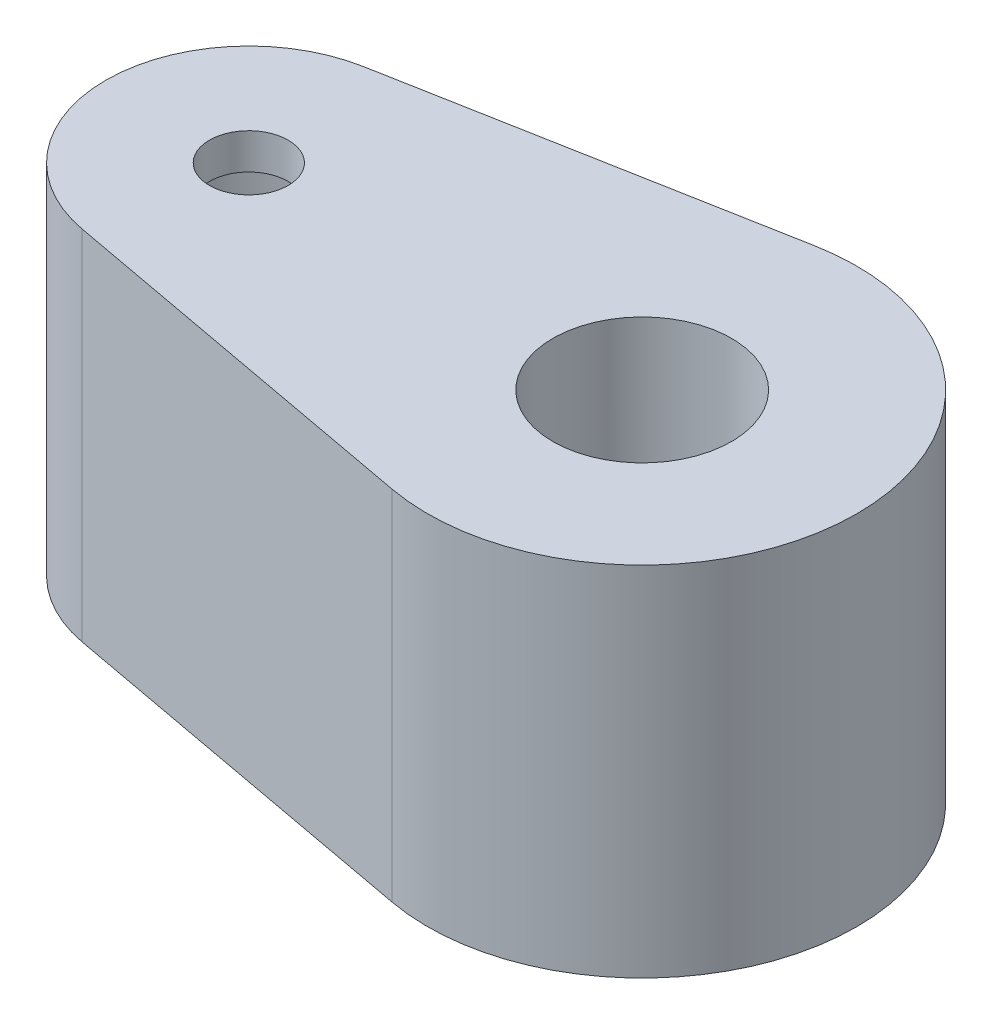
ISO-10303-21;
HEADER;
FILE_DESCRIPTION(('STEP AP214'),'2;1');
FILE_NAME('part.step','',(''),(''),'','','');
FILE_SCHEMA(('AUTOMOTIVE_DESIGN { 1 0 10303 214 1 1 1 1 }'));
ENDSEC;
DATA;
#1=APPLICATION_CONTEXT('core data for automotive mechanical design processes');
#2=APPLICATION_PROTOCOL_DEFINITION('international standard','automotive_design',2000,#1);
#3=PRODUCT_CONTEXT('',#1,'mechanical');
#4=PRODUCT('Part','Part','',(#3));
#5=PRODUCT_RELATED_PRODUCT_CATEGORY('part','',(#4));
#6=PRODUCT_DEFINITION_FORMATION('','',#4);
#7=PRODUCT_DEFINITION_CONTEXT('part definition',#1,'design');
#8=PRODUCT_DEFINITION('design','',#6,#7);
#9=PRODUCT_DEFINITION_SHAPE('','',#8);
#10=(LENGTH_UNIT() NAMED_UNIT(*) SI_UNIT(.MILLI.,.METRE.));
#11=(NAMED_UNIT(*) PLANE_ANGLE_UNIT() SI_UNIT($,.RADIAN.));
#12=(NAMED_UNIT(*) SI_UNIT($,.STERADIAN.) SOLID_ANGLE_UNIT());
#13=UNCERTAINTY_MEASURE_WITH_UNIT(LENGTH_MEASURE(1.E-05),#10,'distance_accuracy_value','');
#14=(GEOMETRIC_REPRESENTATION_CONTEXT(3) GLOBAL_UNCERTAINTY_ASSIGNED_CONTEXT((#13)) GLOBAL_UNIT_ASSIGNED_CONTEXT((#10,
#11,#12)) REPRESENTATION_CONTEXT('',''));
#15=CARTESIAN_POINT('',(0.,0.,0.));
#16=DIRECTION('',(0.,0.,1.));
#17=DIRECTION('',(1.,0.,0.));
#18=AXIS2_PLACEMENT_3D('',#15,#16,#17);
#19=CARTESIAN_POINT('',(11.,-31.4069194034804,0.));
#20=DIRECTION('',(0.,1.,0.));
#21=DIRECTION('',(0.,0.,1.));
#22=AXIS2_PLACEMENT_3D('',#19,#20,#21);
#23=CYLINDRICAL_SURFACE('',#22,2.5);
#24=CARTESIAN_POINT('',(11.,0.,0.));
#25=DIRECTION('',(0.,1.,0.));
#26=DIRECTION('',(0.,0.,1.));
#27=AXIS2_PLACEMENT_3D('',#24,#25,#26);
#28=CIRCLE('',#27,2.5);
#29=CARTESIAN_POINT('',(11.,0.,2.5));
#30=VERTEX_POINT('',#29);
#31=EDGE_CURVE('E85',#30,#30,#28,.T.);
#32=ORIENTED_EDGE('',*,*,#31,.T.);
#33=EDGE_LOOP('',(#32));
#34=FACE_BOUND('',#33,.T.);
#35=CARTESIAN_POINT('',(11.,-7.,0.));
#36=DIRECTION('',(0.,-1.,0.));
#37=DIRECTION('',(0.,0.,-1.));
#38=AXIS2_PLACEMENT_3D('',#35,#36,#37);
#39=CIRCLE('',#38,2.5);
#40=CARTESIAN_POINT('',(11.,-7.,-2.5));
#41=VERTEX_POINT('',#40);
#42=EDGE_CURVE('E106',#41,#41,#39,.F.);
#43=ORIENTED_EDGE('',*,*,#42,.F.);
#44=EDGE_LOOP('',(#43));
#45=FACE_BOUND('',#44,.T.);
#46=ADVANCED_FACE('F35',(#34,#45),#23,.F.);
#47=CARTESIAN_POINT('',(0.,-1.,0.));
#48=DIRECTION('',(0.,-1.,0.));
#49=DIRECTION('',(0.,0.,-1.));
#50=AXIS2_PLACEMENT_3D('',#47,#48,#49);
#51=PLANE('',#50);
#52=CARTESIAN_POINT('',(0.,-1.,0.));
#53=DIRECTION('',(0.,-1.,0.));
#54=DIRECTION('',(0.,0.,-1.));
#55=AXIS2_PLACEMENT_3D('',#52,#53,#54);
#56=CIRCLE('',#55,1.1);
#57=CARTESIAN_POINT('',(0.,-0.999999999999999,-1.1));
#58=VERTEX_POINT('',#57);
#59=EDGE_CURVE('E101',#58,#58,#56,.T.);
#60=ORIENTED_EDGE('',*,*,#59,.F.);
#61=EDGE_LOOP('',(#60));
#62=FACE_BOUND('',#61,.T.);
#63=CARTESIAN_POINT('',(0.,-1.,0.));
#64=DIRECTION('',(0.,-1.,0.));
#65=DIRECTION('',(0.,0.,-1.));
#66=AXIS2_PLACEMENT_3D('',#63,#64,#65);
#67=CIRCLE('',#66,3.25);
#68=CARTESIAN_POINT('',(0.,-1.,-3.25));
#69=VERTEX_POINT('',#68);
#70=EDGE_CURVE('E11',#69,#69,#67,.F.);
#71=ORIENTED_EDGE('',*,*,#70,.F.);
#72=EDGE_LOOP('',(#71));
#73=FACE_BOUND('',#72,.T.);
#74=ADVANCED_FACE('F152',(#62,#73),#51,.T.);
#75=CARTESIAN_POINT('',(0.,6.5,0.));
#76=DIRECTION('',(0.,-1.,0.));
#77=DIRECTION('',(0.,0.,-1.));
#78=AXIS2_PLACEMENT_3D('',#75,#76,#77);
#79=CYLINDRICAL_SURFACE('',#78,1.1);
#80=CARTESIAN_POINT('',(0.,0.,0.));
#81=DIRECTION('',(0.,-1.,0.));
#82=DIRECTION('',(0.,0.,-1.));
#83=AXIS2_PLACEMENT_3D('',#80,#81,#82);
#84=CIRCLE('',#83,1.1);
#85=CARTESIAN_POINT('',(0.,0.,-1.1));
#86=VERTEX_POINT('',#85);
#87=EDGE_CURVE('E39',#86,#86,#84,.T.);
#88=CARTESIAN_POINT('',(0.,0.,-1.1));
#89=CARTESIAN_POINT('',(0.,-0.0104166666666667,-1.1));
#90=CARTESIAN_POINT('',(0.,-0.0208333333333333,-1.1));
#91=CARTESIAN_POINT('',(0.,-0.0416666666666667,-1.1));
#92=CARTESIAN_POINT('',(0.,-0.0520833333333334,-1.1));
#93=CARTESIAN_POINT('',(0.,-0.0729166666666667,-1.1));
#94=CARTESIAN_POINT('',(0.,-0.0833333333333334,-1.1));
#95=CARTESIAN_POINT('',(0.,-0.104166666666667,-1.1));
#96=CARTESIAN_POINT('',(0.,-0.114583333333333,-1.1));
#97=CARTESIAN_POINT('',(0.,-0.135416666666667,-1.1));
#98=CARTESIAN_POINT('',(0.,-0.145833333333333,-1.1));
#99=CARTESIAN_POINT('',(0.,-0.166666666666667,-1.1));
#100=CARTESIAN_POINT('',(0.,-0.177083333333333,-1.1));
#101=CARTESIAN_POINT('',(0.,-0.197916666666667,-1.1));
#102=CARTESIAN_POINT('',(0.,-0.208333333333334,-1.1));
#103=CARTESIAN_POINT('',(0.,-0.229166666666667,-1.1));
#104=CARTESIAN_POINT('',(0.,-0.239583333333334,-1.1));
#105=CARTESIAN_POINT('',(0.,-0.260416666666667,-1.1));
#106=CARTESIAN_POINT('',(0.,-0.270833333333333,-1.1));
#107=CARTESIAN_POINT('',(0.,-0.291666666666666,-1.1));
#108=CARTESIAN_POINT('',(0.,-0.302083333333333,-1.1));
#109=CARTESIAN_POINT('',(0.,-0.322916666666666,-1.1));
#110=CARTESIAN_POINT('',(0.,-0.333333333333333,-1.1));
#111=CARTESIAN_POINT('',(0.,-0.354166666666666,-1.1));
#112=CARTESIAN_POINT('',(0.,-0.364583333333333,-1.1));
#113=CARTESIAN_POINT('',(0.,-0.385416666666666,-1.1));
#114=CARTESIAN_POINT('',(0.,-0.395833333333333,-1.1));
#115=CARTESIAN_POINT('',(0.,-0.416666666666666,-1.1));
#116=CARTESIAN_POINT('',(0.,-0.427083333333333,-1.1));
#117=CARTESIAN_POINT('',(0.,-0.447916666666666,-1.1));
#118=CARTESIAN_POINT('',(0.,-0.458333333333333,-1.1));
#119=CARTESIAN_POINT('',(0.,-0.479166666666666,-1.1));
#120=CARTESIAN_POINT('',(0.,-0.489583333333333,-1.1));
#121=CARTESIAN_POINT('',(0.,-0.510416666666666,-1.1));
#122=CARTESIAN_POINT('',(0.,-0.520833333333333,-1.1));
#123=CARTESIAN_POINT('',(0.,-0.541666666666666,-1.1));
#124=CARTESIAN_POINT('',(0.,-0.552083333333333,-1.1));
#125=CARTESIAN_POINT('',(0.,-0.572916666666666,-1.1));
#126=CARTESIAN_POINT('',(0.,-0.583333333333333,-1.1));
#127=CARTESIAN_POINT('',(0.,-0.604166666666666,-1.1));
#128=CARTESIAN_POINT('',(0.,-0.614583333333333,-1.1));
#129=CARTESIAN_POINT('',(0.,-0.635416666666666,-1.1));
#130=CARTESIAN_POINT('',(0.,-0.645833333333333,-1.1));
#131=CARTESIAN_POINT('',(0.,-0.666666666666666,-1.1));
#132=CARTESIAN_POINT('',(0.,-0.677083333333333,-1.1));
#133=CARTESIAN_POINT('',(0.,-0.697916666666666,-1.1));
#134=CARTESIAN_POINT('',(0.,-0.708333333333332,-1.1));
#135=CARTESIAN_POINT('',(0.,-0.729166666666666,-1.1));
#136=CARTESIAN_POINT('',(0.,-0.739583333333332,-1.1));
#137=CARTESIAN_POINT('',(0.,-0.760416666666666,-1.1));
#138=CARTESIAN_POINT('',(0.,-0.770833333333332,-1.1));
#139=CARTESIAN_POINT('',(0.,-0.791666666666666,-1.1));
#140=CARTESIAN_POINT('',(0.,-0.802083333333332,-1.1));
#141=CARTESIAN_POINT('',(0.,-0.822916666666666,-1.1));
#142=CARTESIAN_POINT('',(0.,-0.833333333333332,-1.1));
#143=CARTESIAN_POINT('',(0.,-0.854166666666666,-1.1));
#144=CARTESIAN_POINT('',(0.,-0.864583333333332,-1.1));
#145=CARTESIAN_POINT('',(0.,-0.885416666666666,-1.1));
#146=CARTESIAN_POINT('',(0.,-0.895833333333332,-1.1));
#147=CARTESIAN_POINT('',(0.,-0.916666666666666,-1.1));
#148=CARTESIAN_POINT('',(0.,-0.927083333333332,-1.1));
#149=CARTESIAN_POINT('',(0.,-0.947916666666666,-1.1));
#150=CARTESIAN_POINT('',(0.,-0.958333333333332,-1.1));
#151=CARTESIAN_POINT('',(0.,-0.979166666666666,-1.1));
#152=CARTESIAN_POINT('',(0.,-0.989583333333333,-1.1));
#153=CARTESIAN_POINT('',(0.,-0.999999999999999,-1.1));
#154=B_SPLINE_CURVE_WITH_KNOTS('',3,(#88,#89,#90,#91,#92,#93,#94,#95,#96,#97,#98,#99,#100,#101,
#102,#103,#104,#105,#106,#107,#108,#109,#110,#111,#112,#113,#114,#115,#116,#117,#118,#119,#120,
#121,#122,#123,#124,#125,#126,#127,#128,#129,#130,#131,#132,#133,#134,#135,#136,#137,#138,#139,
#140,#141,#142,#143,#144,#145,#146,#147,#148,#149,#150,#151,#152,#153),.UNSPECIFIED.,.F.,.F.,(4,
2,2,2,2,2,2,2,2,2,2,2,2,2,2,2,2,2,2,2,2,2,2,2,2,2,2,2,2,2,2,2,4),(0.,0.03125,0.0625000000000001,
0.0937500000000001,0.125,0.15625,0.1875,0.21875,0.25,0.281249999999999,0.312499999999999,
0.343749999999999,0.374999999999999,0.40625,0.4375,0.46875,0.5,0.53125,0.5625,0.59375,0.625,
0.65625,0.6875,0.718749999999999,0.749999999999999,0.781249999999999,0.812499999999999,
0.843749999999999,0.874999999999999,0.906249999999999,0.937499999999999,0.968749999999999,
0.999999999999999),.UNSPECIFIED.);
#155=EDGE_CURVE('BSEAM37',#86,#58,#154,.T.);
#156=ORIENTED_EDGE('',*,*,#87,.F.);
#157=ORIENTED_EDGE('',*,*,#59,.T.);
#158=ORIENTED_EDGE('',*,*,#155,.T.);
#159=ORIENTED_EDGE('',*,*,#155,.F.);
#160=EDGE_LOOP('',(#156,#158,#157,#159));
#161=FACE_BOUND('',#160,.T.);
#162=ADVANCED_FACE('F37',(#161),#79,.F.);
#163=CARTESIAN_POINT('',(0.,0.,0.));
#164=DIRECTION('',(0.,-1.,0.));
#165=DIRECTION('',(0.,0.,-1.));
#166=AXIS2_PLACEMENT_3D('',#163,#164,#165);
#167=PLANE('',#166);
#168=CARTESIAN_POINT('',(0.,0.,0.));
#169=DIRECTION('',(0.,-1.,0.));
#170=DIRECTION('',(0.,0.,-1.));
#171=AXIS2_PLACEMENT_3D('',#168,#169,#170);
#172=CIRCLE('',#171,4.);
#173=CARTESIAN_POINT('',(-0.727272727272728,0.,3.93332866414254));
#174=VERTEX_POINT('',#173);
#175=CARTESIAN_POINT('',(-0.727272727272727,0.,-3.93332866414253));
#176=VERTEX_POINT('',#175);
#177=EDGE_CURVE('E44',#174,#176,#172,.T.);
#178=ORIENTED_EDGE('',*,*,#177,.F.);
#179=DIRECTION('',(0.983332166035633,0.,0.181818181818182));
#180=VECTOR('',#179,1.);
#181=CARTESIAN_POINT('',(-0.727272727272728,0.,3.93332866414254));
#182=LINE('',#181,#180);
#183=CARTESIAN_POINT('',(9.90909090909091,0.,5.8999929962138));
#184=VERTEX_POINT('',#183);
#185=EDGE_CURVE('E76',#174,#184,#182,.T.);
#186=ORIENTED_EDGE('',*,*,#185,.T.);
#187=CARTESIAN_POINT('',(11.,0.,0.));
#188=DIRECTION('',(0.,1.,0.));
#189=DIRECTION('',(0.,0.,1.));
#190=AXIS2_PLACEMENT_3D('',#187,#188,#189);
#191=CIRCLE('',#190,6.);
#192=CARTESIAN_POINT('',(9.90909090909091,0.,-5.8999929962138));
#193=VERTEX_POINT('',#192);
#194=EDGE_CURVE('E84',#184,#193,#191,.T.);
#195=ORIENTED_EDGE('',*,*,#194,.T.);
#196=DIRECTION('',(-0.983332166035633,0.,0.181818181818182));
#197=VECTOR('',#196,1.);
#198=CARTESIAN_POINT('',(-0.727272727272727,0.,-3.93332866414253));
#199=LINE('',#198,#197);
#200=EDGE_CURVE('E100',#193,#176,#199,.T.);
#201=ORIENTED_EDGE('',*,*,#200,.T.);
#202=EDGE_LOOP('',(#178,#186,#195,#201));
#203=FACE_BOUND('',#202,.T.);
#204=ORIENTED_EDGE('',*,*,#31,.F.);
#205=EDGE_LOOP('',(#204));
#206=FACE_BOUND('',#205,.T.);
#207=ORIENTED_EDGE('',*,*,#87,.T.);
#208=EDGE_LOOP('',(#207));
#209=FACE_BOUND('',#208,.T.);
#210=ADVANCED_FACE('F97',(#203,#206,#209),#167,.F.);
#211=CARTESIAN_POINT('',(0.,-1.,0.));
#212=DIRECTION('',(0.,1.,0.));
#213=DIRECTION('',(0.,0.,1.));
#214=AXIS2_PLACEMENT_3D('',#211,#212,#213);
#215=CYLINDRICAL_SURFACE('',#214,4.);
#216=CARTESIAN_POINT('',(0.,-10.,0.));
#217=DIRECTION('',(0.,-1.,0.));
#218=DIRECTION('',(0.,0.,-1.));
#219=AXIS2_PLACEMENT_3D('',#216,#217,#218);
#220=CIRCLE('',#219,4.);
#221=CARTESIAN_POINT('',(-0.727272727272727,-10.,3.93332866414253));
#222=VERTEX_POINT('',#221);
#223=CARTESIAN_POINT('',(-0.727272727272727,-10.,-3.93332866414253));
#224=VERTEX_POINT('',#223);
#225=EDGE_CURVE('E93',#222,#224,#220,.T.);
#226=ORIENTED_EDGE('',*,*,#225,.F.);
#227=DIRECTION('',(0.,1.,0.));
#228=VECTOR('',#227,1.);
#229=CARTESIAN_POINT('',(-0.727272727272728,-31.4069194034804,3.93332866414254));
#230=LINE('',#229,#228);
#231=EDGE_CURVE('E52',#222,#174,#230,.T.);
#232=ORIENTED_EDGE('',*,*,#231,.T.);
#233=ORIENTED_EDGE('',*,*,#177,.T.);
#234=DIRECTION('',(0.,1.,0.));
#235=VECTOR('',#234,1.);
#236=CARTESIAN_POINT('',(-0.727272727272727,-31.4069194034804,-3.93332866414253));
#237=LINE('',#236,#235);
#238=EDGE_CURVE('E127',#224,#176,#237,.T.);
#239=ORIENTED_EDGE('',*,*,#238,.F.);
#240=EDGE_LOOP('',(#226,#232,#233,#239));
#241=FACE_BOUND('',#240,.T.);
#242=ADVANCED_FACE('F90',(#241),#215,.T.);
#243=CARTESIAN_POINT('',(0.,-10.,0.));
#244=DIRECTION('',(0.,-1.,0.));
#245=DIRECTION('',(0.,0.,-1.));
#246=AXIS2_PLACEMENT_3D('',#243,#244,#245);
#247=PLANE('',#246);
#248=CARTESIAN_POINT('',(11.,-10.,0.));
#249=DIRECTION('',(0.,-1.,0.));
#250=DIRECTION('',(0.,0.,-1.));
#251=AXIS2_PLACEMENT_3D('',#248,#249,#250);
#252=CIRCLE('',#251,4.5);
#253=CARTESIAN_POINT('',(11.,-10.,-4.5));
#254=VERTEX_POINT('',#253);
#255=EDGE_CURVE('E114',#254,#254,#252,.T.);
#256=ORIENTED_EDGE('',*,*,#255,.F.);
#257=EDGE_LOOP('',(#256));
#258=FACE_BOUND('',#257,.T.);
#259=ORIENTED_EDGE('',*,*,#225,.T.);
#260=DIRECTION('',(-0.983332166035634,0.,0.181818181818182));
#261=VECTOR('',#260,1.);
#262=CARTESIAN_POINT('',(-0.727272727272727,-10.,-3.93332866414253));
#263=LINE('',#262,#261);
#264=CARTESIAN_POINT('',(9.90909090909091,-10.,-5.8999929962138));
#265=VERTEX_POINT('',#264);
#266=EDGE_CURVE('E94',#265,#224,#263,.T.);
#267=ORIENTED_EDGE('',*,*,#266,.F.);
#268=CARTESIAN_POINT('',(11.,-10.,0.));
#269=DIRECTION('',(0.,-1.,0.));
#270=DIRECTION('',(0.,0.,-1.));
#271=AXIS2_PLACEMENT_3D('',#268,#269,#270);
#272=CIRCLE('',#271,6.);
#273=CARTESIAN_POINT('',(9.90909090909091,-10.,5.8999929962138));
#274=VERTEX_POINT('',#273);
#275=EDGE_CURVE('E59',#274,#265,#272,.F.);
#276=ORIENTED_EDGE('',*,*,#275,.F.);
#277=DIRECTION('',(0.983332166035634,0.,0.181818181818182));
#278=VECTOR('',#277,1.);
#279=CARTESIAN_POINT('',(-0.727272727272728,-10.,3.93332866414254));
#280=LINE('',#279,#278);
#281=EDGE_CURVE('E108',#222,#274,#280,.T.);
#282=ORIENTED_EDGE('',*,*,#281,.F.);
#283=EDGE_LOOP('',(#259,#267,#276,#282));
#284=FACE_BOUND('',#283,.T.);
#285=CARTESIAN_POINT('',(0.,-10.,0.));
#286=DIRECTION('',(0.,-1.,0.));
#287=DIRECTION('',(0.,0.,-1.));
#288=AXIS2_PLACEMENT_3D('',#285,#286,#287);
#289=CIRCLE('',#288,3.25);
#290=CARTESIAN_POINT('',(0.,-10.,-3.25));
#291=VERTEX_POINT('',#290);
#292=EDGE_CURVE('E125',#291,#291,#289,.T.);
#293=ORIENTED_EDGE('',*,*,#292,.F.);
#294=EDGE_LOOP('',(#293));
#295=FACE_BOUND('',#294,.T.);
#296=ADVANCED_FACE('F134',(#258,#284,#295),#247,.T.);
#297=CARTESIAN_POINT('',(0.,-10.,0.));
#298=DIRECTION('',(0.,1.,0.));
#299=DIRECTION('',(0.,0.,1.));
#300=AXIS2_PLACEMENT_3D('',#297,#298,#299);
#301=CYLINDRICAL_SURFACE('',#300,3.25);
#302=ORIENTED_EDGE('',*,*,#292,.T.);
#303=EDGE_LOOP('',(#302));
#304=FACE_BOUND('',#303,.T.);
#305=ORIENTED_EDGE('',*,*,#70,.T.);
#306=EDGE_LOOP('',(#305));
#307=FACE_BOUND('',#306,.T.);
#308=ADVANCED_FACE('F149',(#304,#307),#301,.F.);
#309=CARTESIAN_POINT('',(-0.727272727272728,-31.4069194034804,3.93332866414254));
#310=DIRECTION('',(-0.181818181818182,0.,0.983332166035633));
#311=DIRECTION('',(0.983332166035634,0.,0.181818181818182));
#312=AXIS2_PLACEMENT_3D('',#309,#310,#311);
#313=PLANE('',#312);
#314=ORIENTED_EDGE('',*,*,#231,.F.);
#315=ORIENTED_EDGE('',*,*,#281,.T.);
#316=DIRECTION('',(0.,1.,0.));
#317=VECTOR('',#316,1.);
#318=CARTESIAN_POINT('',(9.90909090909091,-31.4069194034804,5.8999929962138));
#319=LINE('',#318,#317);
#320=EDGE_CURVE('E79',#274,#184,#319,.T.);
#321=ORIENTED_EDGE('',*,*,#320,.T.);
#322=ORIENTED_EDGE('',*,*,#185,.F.);
#323=EDGE_LOOP('',(#314,#315,#321,#322));
#324=FACE_BOUND('',#323,.T.);
#325=ADVANCED_FACE('F77',(#324),#313,.T.);
#326=CARTESIAN_POINT('',(-0.727272727272727,-31.4069194034804,-3.93332866414253));
#327=DIRECTION('',(-0.181818181818182,0.,-0.983332166035633));
#328=DIRECTION('',(-0.983332166035634,0.,0.181818181818182));
#329=AXIS2_PLACEMENT_3D('',#326,#327,#328);
#330=PLANE('',#329);
#331=DIRECTION('',(0.,1.,0.));
#332=VECTOR('',#331,1.);
#333=CARTESIAN_POINT('',(9.90909090909091,-31.4069194034804,-5.8999929962138));
#334=LINE('',#333,#332);
#335=EDGE_CURVE('E123',#265,#193,#334,.T.);
#336=ORIENTED_EDGE('',*,*,#335,.F.);
#337=ORIENTED_EDGE('',*,*,#266,.T.);
#338=ORIENTED_EDGE('',*,*,#238,.T.);
#339=ORIENTED_EDGE('',*,*,#200,.F.);
#340=EDGE_LOOP('',(#336,#337,#338,#339));
#341=FACE_BOUND('',#340,.T.);
#342=ADVANCED_FACE('F140',(#341),#330,.T.);
#343=CARTESIAN_POINT('',(11.,-31.4069194034804,0.));
#344=DIRECTION('',(0.,1.,0.));
#345=DIRECTION('',(0.,0.,1.));
#346=AXIS2_PLACEMENT_3D('',#343,#344,#345);
#347=CYLINDRICAL_SURFACE('',#346,6.);
#348=ORIENTED_EDGE('',*,*,#320,.F.);
#349=ORIENTED_EDGE('',*,*,#275,.T.);
#350=ORIENTED_EDGE('',*,*,#335,.T.);
#351=ORIENTED_EDGE('',*,*,#194,.F.);
#352=EDGE_LOOP('',(#348,#349,#350,#351));
#353=FACE_BOUND('',#352,.T.);
#354=ADVANCED_FACE('F138',(#353),#347,.T.);
#355=CARTESIAN_POINT('',(11.,-7.,0.));
#356=DIRECTION('',(0.,-1.,0.));
#357=DIRECTION('',(0.,0.,-1.));
#358=AXIS2_PLACEMENT_3D('',#355,#356,#357);
#359=PLANE('',#358);
#360=CARTESIAN_POINT('',(11.,-7.,0.));
#361=DIRECTION('',(0.,-1.,0.));
#362=DIRECTION('',(0.,0.,-1.));
#363=AXIS2_PLACEMENT_3D('',#360,#361,#362);
#364=CIRCLE('',#363,4.5);
#365=CARTESIAN_POINT('',(11.,-7.,-4.5));
#366=VERTEX_POINT('',#365);
#367=EDGE_CURVE('E109',#366,#366,#364,.T.);
#368=ORIENTED_EDGE('',*,*,#367,.T.);
#369=EDGE_LOOP('',(#368));
#370=FACE_BOUND('',#369,.T.);
#371=ORIENTED_EDGE('',*,*,#42,.T.);
#372=EDGE_LOOP('',(#371));
#373=FACE_BOUND('',#372,.T.);
#374=ADVANCED_FACE('F147',(#370,#373),#359,.T.);
#375=CARTESIAN_POINT('',(11.,-7.,0.));
#376=DIRECTION('',(0.,-1.,0.));
#377=DIRECTION('',(0.,0.,-1.));
#378=AXIS2_PLACEMENT_3D('',#375,#376,#377);
#379=CYLINDRICAL_SURFACE('',#378,4.5);
#380=ORIENTED_EDGE('',*,*,#367,.F.);
#381=EDGE_LOOP('',(#380));
#382=FACE_BOUND('',#381,.T.);
#383=ORIENTED_EDGE('',*,*,#255,.T.);
#384=EDGE_LOOP('',(#383));
#385=FACE_BOUND('',#384,.T.);
#386=ADVANCED_FACE('F212',(#382,#385),#379,.F.);
#387=CLOSED_SHELL('',(#46,#74,#162,#210,#242,#296,#308,#325,#342,#354,#374,#386));
#388=MANIFOLD_SOLID_BREP('B2',#387);
#389=ADVANCED_BREP_SHAPE_REPRESENTATION('',(#18,#388),#14);
#390=SHAPE_DEFINITION_REPRESENTATION(#9,#389);
ENDSEC;
END-ISO-10303-21;
